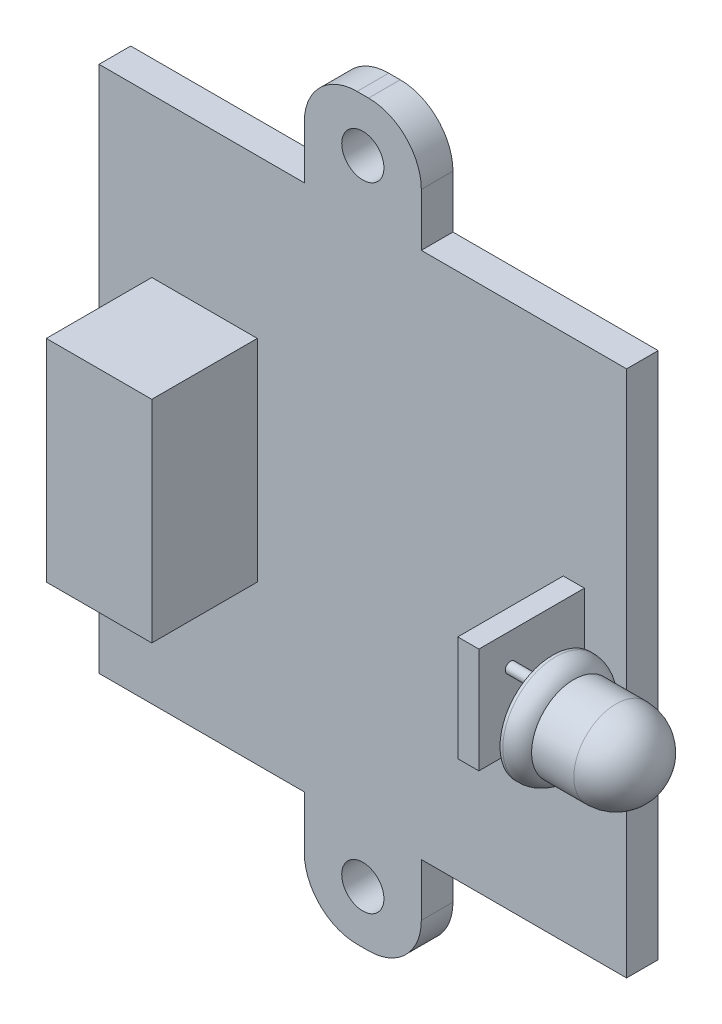
ISO-10303-21;
HEADER;
FILE_DESCRIPTION(('STEP AP214'),'2;1');
FILE_NAME('part.step','',(''),(''),'','','');
FILE_SCHEMA(('AUTOMOTIVE_DESIGN { 1 0 10303 214 1 1 1 1 }'));
ENDSEC;
DATA;
#1=APPLICATION_CONTEXT('core data for automotive mechanical design processes');
#2=APPLICATION_PROTOCOL_DEFINITION('international standard','automotive_design',2000,#1);
#3=PRODUCT_CONTEXT('',#1,'mechanical');
#4=PRODUCT('Part','Part','',(#3));
#5=PRODUCT_RELATED_PRODUCT_CATEGORY('part','',(#4));
#6=PRODUCT_DEFINITION_FORMATION('','',#4);
#7=PRODUCT_DEFINITION_CONTEXT('part definition',#1,'design');
#8=PRODUCT_DEFINITION('design','',#6,#7);
#9=PRODUCT_DEFINITION_SHAPE('','',#8);
#10=(LENGTH_UNIT() NAMED_UNIT(*) SI_UNIT(.MILLI.,.METRE.));
#11=(NAMED_UNIT(*) PLANE_ANGLE_UNIT() SI_UNIT($,.RADIAN.));
#12=(NAMED_UNIT(*) SI_UNIT($,.STERADIAN.) SOLID_ANGLE_UNIT());
#13=UNCERTAINTY_MEASURE_WITH_UNIT(LENGTH_MEASURE(1.E-05),#10,'distance_accuracy_value','');
#14=(GEOMETRIC_REPRESENTATION_CONTEXT(3) GLOBAL_UNCERTAINTY_ASSIGNED_CONTEXT((#13)) GLOBAL_UNIT_ASSIGNED_CONTEXT((#10,
#11,#12)) REPRESENTATION_CONTEXT('',''));
#15=CARTESIAN_POINT('',(0.,0.,0.));
#16=DIRECTION('',(0.,0.,1.));
#17=DIRECTION('',(1.,0.,0.));
#18=AXIS2_PLACEMENT_3D('',#15,#16,#17);
#19=CARTESIAN_POINT('',(28.,12.5,5.));
#20=DIRECTION('',(1.,0.,0.));
#21=DIRECTION('',(0.,0.,-1.));
#22=AXIS2_PLACEMENT_3D('',#19,#20,#21);
#23=SPHERICAL_SURFACE('',#22,2.);
#24=CARTESIAN_POINT('',(30.,12.5,5.));
#25=VERTEX_POINT('',#24);
#26=VERTEX_LOOP('',#25);
#27=FACE_BOUND('',#26,.T.);
#28=CARTESIAN_POINT('',(28.,12.5,5.));
#29=DIRECTION('',(-1.,0.,0.));
#30=DIRECTION('',(0.,0.,1.));
#31=AXIS2_PLACEMENT_3D('',#28,#29,#30);
#32=CIRCLE('',#31,2.);
#33=CARTESIAN_POINT('',(28.,12.5,7.));
#34=VERTEX_POINT('',#33);
#35=EDGE_CURVE('E494',#34,#34,#32,.T.);
#36=ORIENTED_EDGE('',*,*,#35,.F.);
#37=EDGE_LOOP('',(#36));
#38=FACE_BOUND('',#37,.T.);
#39=ADVANCED_FACE('F17',(#27,#38),#23,.T.);
#40=CARTESIAN_POINT('',(30.,12.5,5.));
#41=DIRECTION('',(-1.,0.,0.));
#42=DIRECTION('',(0.,0.,1.));
#43=AXIS2_PLACEMENT_3D('',#40,#41,#42);
#44=CYLINDRICAL_SURFACE('',#43,2.);
#45=ORIENTED_EDGE('',*,*,#35,.T.);
#46=EDGE_LOOP('',(#45));
#47=FACE_BOUND('',#46,.T.);
#48=CARTESIAN_POINT('',(26.,12.5,5.));
#49=DIRECTION('',(1.,0.,0.));
#50=DIRECTION('',(0.,0.,-1.));
#51=AXIS2_PLACEMENT_3D('',#48,#49,#50);
#52=CIRCLE('',#51,2.);
#53=CARTESIAN_POINT('',(26.,12.5,3.));
#54=VERTEX_POINT('',#53);
#55=EDGE_CURVE('E291',#54,#54,#52,.F.);
#56=ORIENTED_EDGE('',*,*,#55,.F.);
#57=EDGE_LOOP('',(#56));
#58=FACE_BOUND('',#57,.T.);
#59=ADVANCED_FACE('F300',(#47,#58),#44,.T.);
#60=CARTESIAN_POINT('',(25.1339745962156,12.5,5.));
#61=DIRECTION('',(1.,0.,0.));
#62=DIRECTION('',(0.,0.,-1.));
#63=AXIS2_PLACEMENT_3D('',#60,#61,#62);
#64=TOROIDAL_SURFACE('',#63,1.5,1.);
#65=CARTESIAN_POINT('',(25.1339745962156,12.5,5.));
#66=DIRECTION('',(-1.,0.,0.));
#67=DIRECTION('',(0.,0.,1.));
#68=AXIS2_PLACEMENT_3D('',#65,#66,#67);
#69=CIRCLE('',#68,2.5);
#70=CARTESIAN_POINT('',(25.1339745962156,12.5,7.5));
#71=VERTEX_POINT('',#70);
#72=EDGE_CURVE('E288',#71,#71,#69,.T.);
#73=ORIENTED_EDGE('',*,*,#72,.F.);
#74=EDGE_LOOP('',(#73));
#75=FACE_BOUND('',#74,.T.);
#76=ORIENTED_EDGE('',*,*,#55,.T.);
#77=EDGE_LOOP('',(#76));
#78=FACE_BOUND('',#77,.T.);
#79=ADVANCED_FACE('F296',(#75,#78),#64,.T.);
#80=CARTESIAN_POINT('',(26.,12.5,5.));
#81=DIRECTION('',(-1.,0.,0.));
#82=DIRECTION('',(0.,0.,1.));
#83=AXIS2_PLACEMENT_3D('',#80,#81,#82);
#84=CYLINDRICAL_SURFACE('',#83,2.5);
#85=ORIENTED_EDGE('',*,*,#72,.T.);
#86=EDGE_LOOP('',(#85));
#87=FACE_BOUND('',#86,.T.);
#88=CARTESIAN_POINT('',(25.,12.5,5.));
#89=DIRECTION('',(-1.,0.,0.));
#90=DIRECTION('',(0.,0.,1.));
#91=AXIS2_PLACEMENT_3D('',#88,#89,#90);
#92=CIRCLE('',#91,2.5);
#93=CARTESIAN_POINT('',(25.,12.5,7.5));
#94=VERTEX_POINT('',#93);
#95=EDGE_CURVE('E21',#94,#94,#92,.F.);
#96=ORIENTED_EDGE('',*,*,#95,.T.);
#97=EDGE_LOOP('',(#96));
#98=FACE_BOUND('',#97,.T.);
#99=ADVANCED_FACE('F299',(#87,#98),#84,.T.);
#100=CARTESIAN_POINT('',(25.,12.5,5.));
#101=DIRECTION('',(1.,0.,0.));
#102=DIRECTION('',(0.,0.,-1.));
#103=AXIS2_PLACEMENT_3D('',#100,#101,#102);
#104=PLANE('',#103);
#105=CARTESIAN_POINT('',(25.,11.5,5.));
#106=DIRECTION('',(-1.,0.,0.));
#107=DIRECTION('',(0.,0.,1.));
#108=AXIS2_PLACEMENT_3D('',#105,#106,#107);
#109=CIRCLE('',#108,0.25);
#110=CARTESIAN_POINT('',(25.,11.5,5.25));
#111=VERTEX_POINT('',#110);
#112=EDGE_CURVE('E287',#111,#111,#109,.T.);
#113=ORIENTED_EDGE('',*,*,#112,.F.);
#114=EDGE_LOOP('',(#113));
#115=FACE_BOUND('',#114,.T.);
#116=ORIENTED_EDGE('',*,*,#95,.F.);
#117=EDGE_LOOP('',(#116));
#118=FACE_BOUND('',#117,.T.);
#119=CARTESIAN_POINT('',(25.,13.5,5.));
#120=DIRECTION('',(-1.,0.,0.));
#121=DIRECTION('',(0.,0.,1.));
#122=AXIS2_PLACEMENT_3D('',#119,#120,#121);
#123=CIRCLE('',#122,0.25);
#124=CARTESIAN_POINT('',(25.,13.5,5.25));
#125=VERTEX_POINT('',#124);
#126=EDGE_CURVE('E274',#125,#125,#123,.T.);
#127=ORIENTED_EDGE('',*,*,#126,.F.);
#128=EDGE_LOOP('',(#127));
#129=FACE_BOUND('',#128,.T.);
#130=ADVANCED_FACE('F437',(#115,#118,#129),#104,.F.);
#131=CARTESIAN_POINT('',(0.,0.,6.5));
#132=DIRECTION('',(0.,0.,-1.));
#133=DIRECTION('',(-1.,0.,0.));
#134=AXIS2_PLACEMENT_3D('',#131,#132,#133);
#135=PLANE('',#134);
#136=DIRECTION('',(1.,0.,0.));
#137=VECTOR('',#136,1.);
#138=CARTESIAN_POINT('',(2.5,17.5,6.5));
#139=LINE('',#138,#137);
#140=CARTESIAN_POINT('',(7.5,17.5,6.5));
#141=VERTEX_POINT('',#140);
#142=CARTESIAN_POINT('',(2.5,17.5,6.5));
#143=VERTEX_POINT('',#142);
#144=EDGE_CURVE('E271',#141,#143,#139,.F.);
#145=ORIENTED_EDGE('',*,*,#144,.T.);
#146=DIRECTION('',(0.,1.,0.));
#147=VECTOR('',#146,1.);
#148=CARTESIAN_POINT('',(2.5,7.5,6.5));
#149=LINE('',#148,#147);
#150=CARTESIAN_POINT('',(2.5,7.5,6.5));
#151=VERTEX_POINT('',#150);
#152=EDGE_CURVE('E253',#143,#151,#149,.F.);
#153=ORIENTED_EDGE('',*,*,#152,.T.);
#154=DIRECTION('',(1.,0.,0.));
#155=VECTOR('',#154,1.);
#156=CARTESIAN_POINT('',(2.5,7.5,6.5));
#157=LINE('',#156,#155);
#158=CARTESIAN_POINT('',(7.5,7.5,6.5));
#159=VERTEX_POINT('',#158);
#160=EDGE_CURVE('E262',#151,#159,#157,.T.);
#161=ORIENTED_EDGE('',*,*,#160,.T.);
#162=DIRECTION('',(0.,1.,0.));
#163=VECTOR('',#162,1.);
#164=CARTESIAN_POINT('',(7.5,7.5,6.5));
#165=LINE('',#164,#163);
#166=EDGE_CURVE('E268',#159,#141,#165,.T.);
#167=ORIENTED_EDGE('',*,*,#166,.T.);
#168=EDGE_LOOP('',(#145,#153,#161,#167));
#169=FACE_BOUND('',#168,.T.);
#170=ADVANCED_FACE('F434',(#169),#135,.F.);
#171=CARTESIAN_POINT('',(25.,11.5,5.));
#172=DIRECTION('',(-1.,0.,0.));
#173=DIRECTION('',(0.,0.,1.));
#174=AXIS2_PLACEMENT_3D('',#171,#172,#173);
#175=CYLINDRICAL_SURFACE('',#174,0.25);
#176=ORIENTED_EDGE('',*,*,#112,.T.);
#177=EDGE_LOOP('',(#176));
#178=FACE_BOUND('',#177,.T.);
#179=CARTESIAN_POINT('',(23.,11.5,5.));
#180=DIRECTION('',(-1.,0.,0.));
#181=DIRECTION('',(0.,0.,1.));
#182=AXIS2_PLACEMENT_3D('',#179,#180,#181);
#183=CIRCLE('',#182,0.25);
#184=CARTESIAN_POINT('',(23.,11.5,5.25));
#185=VERTEX_POINT('',#184);
#186=EDGE_CURVE('E240',#185,#185,#183,.F.);
#187=ORIENTED_EDGE('',*,*,#186,.T.);
#188=EDGE_LOOP('',(#187));
#189=FACE_BOUND('',#188,.T.);
#190=ADVANCED_FACE('F430',(#178,#189),#175,.T.);
#191=CARTESIAN_POINT('',(22.,10.,6.5));
#192=DIRECTION('',(0.,1.,0.));
#193=DIRECTION('',(0.,0.,1.));
#194=AXIS2_PLACEMENT_3D('',#191,#192,#193);
#195=PLANE('',#194);
#196=DIRECTION('',(0.,0.,1.));
#197=VECTOR('',#196,1.);
#198=CARTESIAN_POINT('',(23.,10.,6.5));
#199=LINE('',#198,#197);
#200=CARTESIAN_POINT('',(23.,10.,1.5));
#201=VERTEX_POINT('',#200);
#202=CARTESIAN_POINT('',(23.,10.,6.5));
#203=VERTEX_POINT('',#202);
#204=EDGE_CURVE('E237',#201,#203,#199,.T.);
#205=ORIENTED_EDGE('',*,*,#204,.T.);
#206=DIRECTION('',(1.,0.,0.));
#207=VECTOR('',#206,1.);
#208=CARTESIAN_POINT('',(0.,10.,6.5));
#209=LINE('',#208,#207);
#210=CARTESIAN_POINT('',(22.,10.,6.5));
#211=VERTEX_POINT('',#210);
#212=EDGE_CURVE('E281',#211,#203,#209,.T.);
#213=ORIENTED_EDGE('',*,*,#212,.F.);
#214=DIRECTION('',(0.,0.,-1.));
#215=VECTOR('',#214,1.);
#216=CARTESIAN_POINT('',(22.,10.,6.5));
#217=LINE('',#216,#215);
#218=CARTESIAN_POINT('',(22.,10.,1.5));
#219=VERTEX_POINT('',#218);
#220=EDGE_CURVE('E241',#211,#219,#217,.T.);
#221=ORIENTED_EDGE('',*,*,#220,.T.);
#222=DIRECTION('',(1.,0.,0.));
#223=VECTOR('',#222,1.);
#224=CARTESIAN_POINT('',(22.,10.,1.5));
#225=LINE('',#224,#223);
#226=EDGE_CURVE('E284',#201,#219,#225,.F.);
#227=ORIENTED_EDGE('',*,*,#226,.F.);
#228=EDGE_LOOP('',(#205,#213,#221,#227));
#229=FACE_BOUND('',#228,.T.);
#230=ADVANCED_FACE('F426',(#229),#195,.F.);
#231=CARTESIAN_POINT('',(0.,0.,6.5));
#232=DIRECTION('',(0.,0.,1.));
#233=DIRECTION('',(1.,0.,0.));
#234=AXIS2_PLACEMENT_3D('',#231,#232,#233);
#235=PLANE('',#234);
#236=DIRECTION('',(0.,1.,0.));
#237=VECTOR('',#236,1.);
#238=CARTESIAN_POINT('',(22.,15.,6.5));
#239=LINE('',#238,#237);
#240=CARTESIAN_POINT('',(22.,15.,6.5));
#241=VERTEX_POINT('',#240);
#242=EDGE_CURVE('E244',#241,#211,#239,.F.);
#243=ORIENTED_EDGE('',*,*,#242,.T.);
#244=ORIENTED_EDGE('',*,*,#212,.T.);
#245=DIRECTION('',(0.,1.,0.));
#246=VECTOR('',#245,1.);
#247=CARTESIAN_POINT('',(23.,10.,6.5));
#248=LINE('',#247,#246);
#249=CARTESIAN_POINT('',(23.,15.,6.5));
#250=VERTEX_POINT('',#249);
#251=EDGE_CURVE('E234',#203,#250,#248,.T.);
#252=ORIENTED_EDGE('',*,*,#251,.T.);
#253=DIRECTION('',(1.,0.,0.));
#254=VECTOR('',#253,1.);
#255=CARTESIAN_POINT('',(23.,15.,6.5));
#256=LINE('',#255,#254);
#257=EDGE_CURVE('E278',#250,#241,#256,.F.);
#258=ORIENTED_EDGE('',*,*,#257,.T.);
#259=EDGE_LOOP('',(#243,#244,#252,#258));
#260=FACE_BOUND('',#259,.T.);
#261=ADVANCED_FACE('F422',(#260),#235,.T.);
#262=CARTESIAN_POINT('',(23.,15.,6.5));
#263=DIRECTION('',(0.,-1.,0.));
#264=DIRECTION('',(1.,0.,0.));
#265=AXIS2_PLACEMENT_3D('',#262,#263,#264);
#266=PLANE('',#265);
#267=DIRECTION('',(0.,0.,-1.));
#268=VECTOR('',#267,1.);
#269=CARTESIAN_POINT('',(22.,15.,6.5));
#270=LINE('',#269,#268);
#271=CARTESIAN_POINT('',(22.,15.,1.5));
#272=VERTEX_POINT('',#271);
#273=EDGE_CURVE('E247',#272,#241,#270,.F.);
#274=ORIENTED_EDGE('',*,*,#273,.T.);
#275=ORIENTED_EDGE('',*,*,#257,.F.);
#276=DIRECTION('',(0.,0.,1.));
#277=VECTOR('',#276,1.);
#278=CARTESIAN_POINT('',(23.,15.,6.5));
#279=LINE('',#278,#277);
#280=CARTESIAN_POINT('',(23.,15.,1.5));
#281=VERTEX_POINT('',#280);
#282=EDGE_CURVE('E231',#250,#281,#279,.F.);
#283=ORIENTED_EDGE('',*,*,#282,.T.);
#284=DIRECTION('',(1.,0.,0.));
#285=VECTOR('',#284,1.);
#286=CARTESIAN_POINT('',(23.,15.,1.5));
#287=LINE('',#286,#285);
#288=EDGE_CURVE('E275',#272,#281,#287,.T.);
#289=ORIENTED_EDGE('',*,*,#288,.F.);
#290=EDGE_LOOP('',(#274,#275,#283,#289));
#291=FACE_BOUND('',#290,.T.);
#292=ADVANCED_FACE('F418',(#291),#266,.F.);
#293=CARTESIAN_POINT('',(25.,13.5,5.));
#294=DIRECTION('',(-1.,0.,0.));
#295=DIRECTION('',(0.,0.,1.));
#296=AXIS2_PLACEMENT_3D('',#293,#294,#295);
#297=CYLINDRICAL_SURFACE('',#296,0.25);
#298=ORIENTED_EDGE('',*,*,#126,.T.);
#299=EDGE_LOOP('',(#298));
#300=FACE_BOUND('',#299,.T.);
#301=CARTESIAN_POINT('',(23.,13.5,5.));
#302=DIRECTION('',(-1.,0.,0.));
#303=DIRECTION('',(0.,0.,1.));
#304=AXIS2_PLACEMENT_3D('',#301,#302,#303);
#305=CIRCLE('',#304,0.25);
#306=CARTESIAN_POINT('',(23.,13.5,5.25));
#307=VERTEX_POINT('',#306);
#308=EDGE_CURVE('E220',#307,#307,#305,.F.);
#309=ORIENTED_EDGE('',*,*,#308,.T.);
#310=EDGE_LOOP('',(#309));
#311=FACE_BOUND('',#310,.T.);
#312=ADVANCED_FACE('F414',(#300,#311),#297,.T.);
#313=CARTESIAN_POINT('',(2.5,17.5,6.5));
#314=DIRECTION('',(0.,-1.,0.));
#315=DIRECTION('',(0.,0.,-1.));
#316=AXIS2_PLACEMENT_3D('',#313,#314,#315);
#317=PLANE('',#316);
#318=DIRECTION('',(0.,0.,-1.));
#319=VECTOR('',#318,1.);
#320=CARTESIAN_POINT('',(2.5,17.5,6.5));
#321=LINE('',#320,#319);
#322=CARTESIAN_POINT('',(2.5,17.5,1.5));
#323=VERTEX_POINT('',#322);
#324=EDGE_CURVE('E256',#323,#143,#321,.F.);
#325=ORIENTED_EDGE('',*,*,#324,.T.);
#326=ORIENTED_EDGE('',*,*,#144,.F.);
#327=DIRECTION('',(0.,0.,1.));
#328=VECTOR('',#327,1.);
#329=CARTESIAN_POINT('',(7.5,17.5,6.5));
#330=LINE('',#329,#328);
#331=CARTESIAN_POINT('',(7.5,17.5,1.5));
#332=VERTEX_POINT('',#331);
#333=EDGE_CURVE('E265',#141,#332,#330,.F.);
#334=ORIENTED_EDGE('',*,*,#333,.T.);
#335=DIRECTION('',(1.,0.,0.));
#336=VECTOR('',#335,1.);
#337=CARTESIAN_POINT('',(0.,17.5,1.5));
#338=LINE('',#337,#336);
#339=EDGE_CURVE('E174',#323,#332,#338,.T.);
#340=ORIENTED_EDGE('',*,*,#339,.F.);
#341=EDGE_LOOP('',(#325,#326,#334,#340));
#342=FACE_BOUND('',#341,.T.);
#343=ADVANCED_FACE('F410',(#342),#317,.F.);
#344=CARTESIAN_POINT('',(7.5,7.5,6.5));
#345=DIRECTION('',(-1.,0.,0.));
#346=DIRECTION('',(0.,0.,1.));
#347=AXIS2_PLACEMENT_3D('',#344,#345,#346);
#348=PLANE('',#347);
#349=ORIENTED_EDGE('',*,*,#333,.F.);
#350=ORIENTED_EDGE('',*,*,#166,.F.);
#351=DIRECTION('',(0.,0.,1.));
#352=VECTOR('',#351,1.);
#353=CARTESIAN_POINT('',(7.5,7.5,6.5));
#354=LINE('',#353,#352);
#355=CARTESIAN_POINT('',(7.5,7.5,1.5));
#356=VERTEX_POINT('',#355);
#357=EDGE_CURVE('E259',#159,#356,#354,.F.);
#358=ORIENTED_EDGE('',*,*,#357,.T.);
#359=DIRECTION('',(0.,1.,0.));
#360=VECTOR('',#359,1.);
#361=CARTESIAN_POINT('',(7.5,0.,1.5));
#362=LINE('',#361,#360);
#363=EDGE_CURVE('E171',#332,#356,#362,.F.);
#364=ORIENTED_EDGE('',*,*,#363,.F.);
#365=EDGE_LOOP('',(#349,#350,#358,#364));
#366=FACE_BOUND('',#365,.T.);
#367=ADVANCED_FACE('F406',(#366),#348,.F.);
#368=CARTESIAN_POINT('',(2.5,7.5,6.5));
#369=DIRECTION('',(0.,1.,0.));
#370=DIRECTION('',(0.,0.,1.));
#371=AXIS2_PLACEMENT_3D('',#368,#369,#370);
#372=PLANE('',#371);
#373=ORIENTED_EDGE('',*,*,#357,.F.);
#374=ORIENTED_EDGE('',*,*,#160,.F.);
#375=DIRECTION('',(0.,0.,-1.));
#376=VECTOR('',#375,1.);
#377=CARTESIAN_POINT('',(2.5,7.5,6.5));
#378=LINE('',#377,#376);
#379=CARTESIAN_POINT('',(2.5,7.5,1.5));
#380=VERTEX_POINT('',#379);
#381=EDGE_CURVE('E250',#151,#380,#378,.T.);
#382=ORIENTED_EDGE('',*,*,#381,.T.);
#383=DIRECTION('',(1.,0.,0.));
#384=VECTOR('',#383,1.);
#385=CARTESIAN_POINT('',(0.,7.5,1.5));
#386=LINE('',#385,#384);
#387=EDGE_CURVE('E168',#356,#380,#386,.F.);
#388=ORIENTED_EDGE('',*,*,#387,.F.);
#389=EDGE_LOOP('',(#373,#374,#382,#388));
#390=FACE_BOUND('',#389,.T.);
#391=ADVANCED_FACE('F402',(#390),#372,.F.);
#392=CARTESIAN_POINT('',(2.5,7.5,6.5));
#393=DIRECTION('',(1.,0.,0.));
#394=DIRECTION('',(0.,0.,-1.));
#395=AXIS2_PLACEMENT_3D('',#392,#393,#394);
#396=PLANE('',#395);
#397=ORIENTED_EDGE('',*,*,#381,.F.);
#398=ORIENTED_EDGE('',*,*,#152,.F.);
#399=ORIENTED_EDGE('',*,*,#324,.F.);
#400=DIRECTION('',(0.,1.,0.));
#401=VECTOR('',#400,1.);
#402=CARTESIAN_POINT('',(2.5,0.,1.5));
#403=LINE('',#402,#401);
#404=EDGE_CURVE('E165',#380,#323,#403,.T.);
#405=ORIENTED_EDGE('',*,*,#404,.F.);
#406=EDGE_LOOP('',(#397,#398,#399,#405));
#407=FACE_BOUND('',#406,.T.);
#408=ADVANCED_FACE('F398',(#407),#396,.F.);
#409=CARTESIAN_POINT('',(22.,15.,6.5));
#410=DIRECTION('',(1.,0.,0.));
#411=DIRECTION('',(0.,0.,-1.));
#412=AXIS2_PLACEMENT_3D('',#409,#410,#411);
#413=PLANE('',#412);
#414=ORIENTED_EDGE('',*,*,#220,.F.);
#415=ORIENTED_EDGE('',*,*,#242,.F.);
#416=ORIENTED_EDGE('',*,*,#273,.F.);
#417=DIRECTION('',(0.,1.,0.));
#418=VECTOR('',#417,1.);
#419=CARTESIAN_POINT('',(22.,0.,1.5));
#420=LINE('',#419,#418);
#421=EDGE_CURVE('E158',#219,#272,#420,.T.);
#422=ORIENTED_EDGE('',*,*,#421,.F.);
#423=EDGE_LOOP('',(#414,#415,#416,#422));
#424=FACE_BOUND('',#423,.T.);
#425=ADVANCED_FACE('F394',(#424),#413,.F.);
#426=CARTESIAN_POINT('',(23.,10.,6.5));
#427=DIRECTION('',(-1.,0.,0.));
#428=DIRECTION('',(0.,0.,1.));
#429=AXIS2_PLACEMENT_3D('',#426,#427,#428);
#430=PLANE('',#429);
#431=ORIENTED_EDGE('',*,*,#308,.F.);
#432=EDGE_LOOP('',(#431));
#433=FACE_BOUND('',#432,.T.);
#434=ORIENTED_EDGE('',*,*,#282,.F.);
#435=ORIENTED_EDGE('',*,*,#251,.F.);
#436=ORIENTED_EDGE('',*,*,#204,.F.);
#437=DIRECTION('',(0.,1.,0.));
#438=VECTOR('',#437,1.);
#439=CARTESIAN_POINT('',(23.,0.,1.5));
#440=LINE('',#439,#438);
#441=EDGE_CURVE('E154',#281,#201,#440,.F.);
#442=ORIENTED_EDGE('',*,*,#441,.F.);
#443=EDGE_LOOP('',(#434,#435,#436,#442));
#444=FACE_BOUND('',#443,.T.);
#445=ORIENTED_EDGE('',*,*,#186,.F.);
#446=EDGE_LOOP('',(#445));
#447=FACE_BOUND('',#446,.T.);
#448=ADVANCED_FACE('F390',(#433,#444,#447),#430,.F.);
#449=CARTESIAN_POINT('',(0.,-5.,1.5));
#450=DIRECTION('',(0.,1.,0.));
#451=DIRECTION('',(0.,0.,1.));
#452=AXIS2_PLACEMENT_3D('',#449,#450,#451);
#453=PLANE('',#452);
#454=DIRECTION('',(0.,0.,-1.));
#455=VECTOR('',#454,1.);
#456=CARTESIAN_POINT('',(12.7722949685963,-5.,1.5));
#457=LINE('',#456,#455);
#458=CARTESIAN_POINT('',(12.7722949685963,-5.,1.5));
#459=VERTEX_POINT('',#458);
#460=CARTESIAN_POINT('',(12.7722949685963,-5.,0.));
#461=VERTEX_POINT('',#460);
#462=EDGE_CURVE('E126',#459,#461,#457,.T.);
#463=ORIENTED_EDGE('',*,*,#462,.F.);
#464=DIRECTION('',(1.,0.,0.));
#465=VECTOR('',#464,1.);
#466=CARTESIAN_POINT('',(0.,-5.,1.5));
#467=LINE('',#466,#465);
#468=CARTESIAN_POINT('',(12.2277050314038,-5.,1.5));
#469=VERTEX_POINT('',#468);
#470=EDGE_CURVE('E161',#469,#459,#467,.T.);
#471=ORIENTED_EDGE('',*,*,#470,.F.);
#472=DIRECTION('',(0.,0.,1.));
#473=VECTOR('',#472,1.);
#474=CARTESIAN_POINT('',(12.2277050314038,-5.,1.5));
#475=LINE('',#474,#473);
#476=CARTESIAN_POINT('',(12.2277050314038,-5.,0.));
#477=VERTEX_POINT('',#476);
#478=EDGE_CURVE('E101',#477,#469,#475,.T.);
#479=ORIENTED_EDGE('',*,*,#478,.F.);
#480=DIRECTION('',(1.,0.,0.));
#481=VECTOR('',#480,1.);
#482=CARTESIAN_POINT('',(0.,-5.,0.));
#483=LINE('',#482,#481);
#484=EDGE_CURVE('E189',#461,#477,#483,.F.);
#485=ORIENTED_EDGE('',*,*,#484,.F.);
#486=EDGE_LOOP('',(#463,#471,#479,#485));
#487=FACE_BOUND('',#486,.T.);
#488=ADVANCED_FACE('F386',(#487),#453,.F.);
#489=CARTESIAN_POINT('',(0.,30.,1.5));
#490=DIRECTION('',(0.,1.,0.));
#491=DIRECTION('',(0.,0.,1.));
#492=AXIS2_PLACEMENT_3D('',#489,#490,#491);
#493=PLANE('',#492);
#494=DIRECTION('',(1.,0.,0.));
#495=VECTOR('',#494,1.);
#496=CARTESIAN_POINT('',(0.,30.,1.5));
#497=LINE('',#496,#495);
#498=CARTESIAN_POINT('',(12.7722949685963,30.,1.5));
#499=VERTEX_POINT('',#498);
#500=CARTESIAN_POINT('',(12.2277050314038,30.,1.5));
#501=VERTEX_POINT('',#500);
#502=EDGE_CURVE('E163',#499,#501,#497,.F.);
#503=ORIENTED_EDGE('',*,*,#502,.F.);
#504=DIRECTION('',(0.,0.,-1.));
#505=VECTOR('',#504,1.);
#506=CARTESIAN_POINT('',(12.7722949685963,30.,1.5));
#507=LINE('',#506,#505);
#508=CARTESIAN_POINT('',(12.7722949685963,30.,0.));
#509=VERTEX_POINT('',#508);
#510=EDGE_CURVE('E472',#509,#499,#507,.F.);
#511=ORIENTED_EDGE('',*,*,#510,.F.);
#512=DIRECTION('',(1.,0.,0.));
#513=VECTOR('',#512,1.);
#514=CARTESIAN_POINT('',(0.,30.,0.));
#515=LINE('',#514,#513);
#516=CARTESIAN_POINT('',(12.2277050314038,30.,0.));
#517=VERTEX_POINT('',#516);
#518=EDGE_CURVE('E177',#509,#517,#515,.F.);
#519=ORIENTED_EDGE('',*,*,#518,.T.);
#520=DIRECTION('',(0.,0.,1.));
#521=VECTOR('',#520,1.);
#522=CARTESIAN_POINT('',(12.2277050314038,30.,1.5));
#523=LINE('',#522,#521);
#524=EDGE_CURVE('E471',#501,#517,#523,.F.);
#525=ORIENTED_EDGE('',*,*,#524,.F.);
#526=EDGE_LOOP('',(#503,#511,#519,#525));
#527=FACE_BOUND('',#526,.T.);
#528=ADVANCED_FACE('F382',(#527),#493,.T.);
#529=CARTESIAN_POINT('',(0.,0.,1.5));
#530=DIRECTION('',(0.,0.,1.));
#531=DIRECTION('',(1.,0.,0.));
#532=AXIS2_PLACEMENT_3D('',#529,#530,#531);
#533=PLANE('',#532);
#534=ORIENTED_EDGE('',*,*,#441,.T.);
#535=ORIENTED_EDGE('',*,*,#226,.T.);
#536=ORIENTED_EDGE('',*,*,#421,.T.);
#537=ORIENTED_EDGE('',*,*,#288,.T.);
#538=EDGE_LOOP('',(#534,#535,#536,#537));
#539=FACE_BOUND('',#538,.T.);
#540=CARTESIAN_POINT('',(12.5,-2.5,1.5));
#541=DIRECTION('',(0.,0.,-1.));
#542=DIRECTION('',(-1.,0.,0.));
#543=AXIS2_PLACEMENT_3D('',#540,#541,#542);
#544=CIRCLE('',#543,1.);
#545=CARTESIAN_POINT('',(11.5,-2.5,1.5));
#546=VERTEX_POINT('',#545);
#547=EDGE_CURVE('E475',#546,#546,#544,.T.);
#548=ORIENTED_EDGE('',*,*,#547,.T.);
#549=EDGE_LOOP('',(#548));
#550=FACE_BOUND('',#549,.T.);
#551=CARTESIAN_POINT('',(12.5,27.5,1.5));
#552=DIRECTION('',(0.,0.,-1.));
#553=DIRECTION('',(-1.,0.,0.));
#554=AXIS2_PLACEMENT_3D('',#551,#552,#553);
#555=CIRCLE('',#554,1.);
#556=CARTESIAN_POINT('',(11.5,27.5,1.5));
#557=VERTEX_POINT('',#556);
#558=EDGE_CURVE('E181',#557,#557,#555,.T.);
#559=ORIENTED_EDGE('',*,*,#558,.T.);
#560=EDGE_LOOP('',(#559));
#561=FACE_BOUND('',#560,.T.);
#562=DIRECTION('',(0.,1.,0.));
#563=VECTOR('',#562,1.);
#564=CARTESIAN_POINT('',(15.2722949685963,0.,1.5));
#565=LINE('',#564,#563);
#566=CARTESIAN_POINT('',(15.2722949685963,27.5,1.5));
#567=VERTEX_POINT('',#566);
#568=CARTESIAN_POINT('',(15.2722949685963,25.,1.5));
#569=VERTEX_POINT('',#568);
#570=EDGE_CURVE('E190',#567,#569,#565,.F.);
#571=ORIENTED_EDGE('',*,*,#570,.F.);
#572=CARTESIAN_POINT('',(12.7722949685963,27.5,1.5));
#573=DIRECTION('',(0.,0.,-1.));
#574=DIRECTION('',(-1.,0.,0.));
#575=AXIS2_PLACEMENT_3D('',#572,#573,#574);
#576=CIRCLE('',#575,2.5);
#577=EDGE_CURVE('E465',#499,#567,#576,.T.);
#578=ORIENTED_EDGE('',*,*,#577,.F.);
#579=ORIENTED_EDGE('',*,*,#502,.T.);
#580=CARTESIAN_POINT('',(12.2277050314038,27.5,1.5));
#581=DIRECTION('',(0.,0.,1.));
#582=DIRECTION('',(1.,0.,0.));
#583=AXIS2_PLACEMENT_3D('',#580,#581,#582);
#584=CIRCLE('',#583,2.5);
#585=CARTESIAN_POINT('',(9.72770503140375,27.5,1.5));
#586=VERTEX_POINT('',#585);
#587=EDGE_CURVE('E468',#586,#501,#584,.F.);
#588=ORIENTED_EDGE('',*,*,#587,.F.);
#589=DIRECTION('',(0.,1.,0.));
#590=VECTOR('',#589,1.);
#591=CARTESIAN_POINT('',(9.72770503140375,0.,1.5));
#592=LINE('',#591,#590);
#593=CARTESIAN_POINT('',(9.72770503140375,25.,1.5));
#594=VERTEX_POINT('',#593);
#595=EDGE_CURVE('E178',#586,#594,#592,.F.);
#596=ORIENTED_EDGE('',*,*,#595,.T.);
#597=DIRECTION('',(1.,0.,0.));
#598=VECTOR('',#597,1.);
#599=CARTESIAN_POINT('',(0.,25.,1.5));
#600=LINE('',#599,#598);
#601=CARTESIAN_POINT('',(0.,25.,1.5));
#602=VERTEX_POINT('',#601);
#603=EDGE_CURVE('E157',#602,#594,#600,.T.);
#604=ORIENTED_EDGE('',*,*,#603,.F.);
#605=DIRECTION('',(0.,1.,0.));
#606=VECTOR('',#605,1.);
#607=CARTESIAN_POINT('',(0.,0.,1.5));
#608=LINE('',#607,#606);
#609=CARTESIAN_POINT('',(0.,0.,1.5));
#610=VERTEX_POINT('',#609);
#611=EDGE_CURVE('E151',#610,#602,#608,.T.);
#612=ORIENTED_EDGE('',*,*,#611,.F.);
#613=DIRECTION('',(1.,0.,0.));
#614=VECTOR('',#613,1.);
#615=CARTESIAN_POINT('',(0.,0.,1.5));
#616=LINE('',#615,#614);
#617=CARTESIAN_POINT('',(9.72770503140375,0.,1.5));
#618=VERTEX_POINT('',#617);
#619=EDGE_CURVE('E113',#610,#618,#616,.T.);
#620=ORIENTED_EDGE('',*,*,#619,.T.);
#621=DIRECTION('',(0.,1.,0.));
#622=VECTOR('',#621,1.);
#623=CARTESIAN_POINT('',(9.72770503140375,0.,1.5));
#624=LINE('',#623,#622);
#625=CARTESIAN_POINT('',(9.72770503140375,-2.5,1.5));
#626=VERTEX_POINT('',#625);
#627=EDGE_CURVE('E107',#626,#618,#624,.T.);
#628=ORIENTED_EDGE('',*,*,#627,.F.);
#629=CARTESIAN_POINT('',(12.2277050314038,-2.5,1.5));
#630=DIRECTION('',(0.,0.,1.));
#631=DIRECTION('',(1.,0.,0.));
#632=AXIS2_PLACEMENT_3D('',#629,#630,#631);
#633=CIRCLE('',#632,2.5);
#634=EDGE_CURVE('E93',#469,#626,#633,.F.);
#635=ORIENTED_EDGE('',*,*,#634,.F.);
#636=ORIENTED_EDGE('',*,*,#470,.T.);
#637=CARTESIAN_POINT('',(12.7722949685963,-2.5,1.5));
#638=DIRECTION('',(0.,0.,-1.));
#639=DIRECTION('',(-1.,0.,0.));
#640=AXIS2_PLACEMENT_3D('',#637,#638,#639);
#641=CIRCLE('',#640,2.5);
#642=CARTESIAN_POINT('',(15.2722949685963,-2.5,1.5));
#643=VERTEX_POINT('',#642);
#644=EDGE_CURVE('E123',#643,#459,#641,.T.);
#645=ORIENTED_EDGE('',*,*,#644,.F.);
#646=DIRECTION('',(0.,1.,0.));
#647=VECTOR('',#646,1.);
#648=CARTESIAN_POINT('',(15.2722949685963,0.,1.5));
#649=LINE('',#648,#647);
#650=CARTESIAN_POINT('',(15.2722949685963,0.,1.5));
#651=VERTEX_POINT('',#650);
#652=EDGE_CURVE('E214',#643,#651,#649,.T.);
#653=ORIENTED_EDGE('',*,*,#652,.T.);
#654=DIRECTION('',(1.,0.,0.));
#655=VECTOR('',#654,1.);
#656=CARTESIAN_POINT('',(0.,0.,1.5));
#657=LINE('',#656,#655);
#658=CARTESIAN_POINT('',(25.,0.,1.5));
#659=VERTEX_POINT('',#658);
#660=EDGE_CURVE('E208',#651,#659,#657,.T.);
#661=ORIENTED_EDGE('',*,*,#660,.T.);
#662=DIRECTION('',(0.,1.,0.));
#663=VECTOR('',#662,1.);
#664=CARTESIAN_POINT('',(25.,0.,1.5));
#665=LINE('',#664,#663);
#666=CARTESIAN_POINT('',(25.,25.,1.5));
#667=VERTEX_POINT('',#666);
#668=EDGE_CURVE('E200',#659,#667,#665,.T.);
#669=ORIENTED_EDGE('',*,*,#668,.T.);
#670=DIRECTION('',(1.,0.,0.));
#671=VECTOR('',#670,1.);
#672=CARTESIAN_POINT('',(0.,25.,1.5));
#673=LINE('',#672,#671);
#674=EDGE_CURVE('E197',#569,#667,#673,.T.);
#675=ORIENTED_EDGE('',*,*,#674,.F.);
#676=EDGE_LOOP('',(#571,#578,#579,#588,#596,#604,#612,#620,#628,#635,#636,#645,#653,#661,#669,#675));
#677=FACE_BOUND('',#676,.T.);
#678=ORIENTED_EDGE('',*,*,#387,.T.);
#679=ORIENTED_EDGE('',*,*,#404,.T.);
#680=ORIENTED_EDGE('',*,*,#339,.T.);
#681=ORIENTED_EDGE('',*,*,#363,.T.);
#682=EDGE_LOOP('',(#678,#679,#680,#681));
#683=FACE_BOUND('',#682,.T.);
#684=ADVANCED_FACE('F109',(#539,#550,#561,#677,#683),#533,.T.);
#685=CARTESIAN_POINT('',(0.,25.,1.5));
#686=DIRECTION('',(0.,1.,0.));
#687=DIRECTION('',(0.,0.,1.));
#688=AXIS2_PLACEMENT_3D('',#685,#686,#687);
#689=PLANE('',#688);
#690=ORIENTED_EDGE('',*,*,#603,.T.);
#691=DIRECTION('',(0.,0.,-1.));
#692=VECTOR('',#691,1.);
#693=CARTESIAN_POINT('',(9.72770503140375,25.,1.5));
#694=LINE('',#693,#692);
#695=CARTESIAN_POINT('',(9.72770503140375,25.,0.));
#696=VERTEX_POINT('',#695);
#697=EDGE_CURVE('E520',#594,#696,#694,.T.);
#698=ORIENTED_EDGE('',*,*,#697,.T.);
#699=DIRECTION('',(1.,0.,0.));
#700=VECTOR('',#699,1.);
#701=CARTESIAN_POINT('',(0.,25.,0.));
#702=LINE('',#701,#700);
#703=CARTESIAN_POINT('',(0.,25.,0.));
#704=VERTEX_POINT('',#703);
#705=EDGE_CURVE('E146',#696,#704,#702,.F.);
#706=ORIENTED_EDGE('',*,*,#705,.T.);
#707=DIRECTION('',(0.,0.,1.));
#708=VECTOR('',#707,1.);
#709=CARTESIAN_POINT('',(0.,25.,1.5));
#710=LINE('',#709,#708);
#711=EDGE_CURVE('E141',#602,#704,#710,.F.);
#712=ORIENTED_EDGE('',*,*,#711,.F.);
#713=EDGE_LOOP('',(#690,#698,#706,#712));
#714=FACE_BOUND('',#713,.T.);
#715=ADVANCED_FACE('F375',(#714),#689,.T.);
#716=CARTESIAN_POINT('',(0.,0.,1.5));
#717=DIRECTION('',(-1.,0.,0.));
#718=DIRECTION('',(0.,0.,1.));
#719=AXIS2_PLACEMENT_3D('',#716,#717,#718);
#720=PLANE('',#719);
#721=ORIENTED_EDGE('',*,*,#611,.T.);
#722=ORIENTED_EDGE('',*,*,#711,.T.);
#723=DIRECTION('',(0.,1.,0.));
#724=VECTOR('',#723,1.);
#725=CARTESIAN_POINT('',(0.,0.,0.));
#726=LINE('',#725,#724);
#727=CARTESIAN_POINT('',(0.,0.,0.));
#728=VERTEX_POINT('',#727);
#729=EDGE_CURVE('E135',#704,#728,#726,.F.);
#730=ORIENTED_EDGE('',*,*,#729,.T.);
#731=DIRECTION('',(0.,0.,1.));
#732=VECTOR('',#731,1.);
#733=CARTESIAN_POINT('',(0.,0.,1.5));
#734=LINE('',#733,#732);
#735=EDGE_CURVE('E138',#728,#610,#734,.T.);
#736=ORIENTED_EDGE('',*,*,#735,.T.);
#737=EDGE_LOOP('',(#721,#722,#730,#736));
#738=FACE_BOUND('',#737,.T.);
#739=ADVANCED_FACE('F371',(#738),#720,.T.);
#740=CARTESIAN_POINT('',(0.,0.,1.5));
#741=DIRECTION('',(0.,1.,0.));
#742=DIRECTION('',(0.,0.,1.));
#743=AXIS2_PLACEMENT_3D('',#740,#741,#742);
#744=PLANE('',#743);
#745=DIRECTION('',(0.,0.,1.));
#746=VECTOR('',#745,1.);
#747=CARTESIAN_POINT('',(9.72770503140375,0.,1.5));
#748=LINE('',#747,#746);
#749=CARTESIAN_POINT('',(9.72770503140375,0.,0.));
#750=VERTEX_POINT('',#749);
#751=EDGE_CURVE('E103',#618,#750,#748,.F.);
#752=ORIENTED_EDGE('',*,*,#751,.F.);
#753=ORIENTED_EDGE('',*,*,#619,.F.);
#754=ORIENTED_EDGE('',*,*,#735,.F.);
#755=DIRECTION('',(1.,0.,0.));
#756=VECTOR('',#755,1.);
#757=CARTESIAN_POINT('',(0.,0.,0.));
#758=LINE('',#757,#756);
#759=EDGE_CURVE('E132',#728,#750,#758,.T.);
#760=ORIENTED_EDGE('',*,*,#759,.T.);
#761=EDGE_LOOP('',(#752,#753,#754,#760));
#762=FACE_BOUND('',#761,.T.);
#763=ADVANCED_FACE('F368',(#762),#744,.F.);
#764=CARTESIAN_POINT('',(9.72770503140375,0.,1.5));
#765=DIRECTION('',(-1.,0.,0.));
#766=DIRECTION('',(0.,0.,1.));
#767=AXIS2_PLACEMENT_3D('',#764,#765,#766);
#768=PLANE('',#767);
#769=ORIENTED_EDGE('',*,*,#627,.T.);
#770=ORIENTED_EDGE('',*,*,#751,.T.);
#771=DIRECTION('',(0.,1.,0.));
#772=VECTOR('',#771,1.);
#773=CARTESIAN_POINT('',(9.72770503140375,0.,0.));
#774=LINE('',#773,#772);
#775=CARTESIAN_POINT('',(9.72770503140375,-2.5,0.));
#776=VERTEX_POINT('',#775);
#777=EDGE_CURVE('E121',#750,#776,#774,.F.);
#778=ORIENTED_EDGE('',*,*,#777,.T.);
#779=DIRECTION('',(0.,0.,1.));
#780=VECTOR('',#779,1.);
#781=CARTESIAN_POINT('',(9.72770503140375,-2.5,1.5));
#782=LINE('',#781,#780);
#783=EDGE_CURVE('E98',#626,#776,#782,.F.);
#784=ORIENTED_EDGE('',*,*,#783,.F.);
#785=EDGE_LOOP('',(#769,#770,#778,#784));
#786=FACE_BOUND('',#785,.T.);
#787=ADVANCED_FACE('F119',(#786),#768,.T.);
#788=CARTESIAN_POINT('',(12.2277050314038,-2.5,1.5));
#789=DIRECTION('',(0.,0.,1.));
#790=DIRECTION('',(1.,0.,0.));
#791=AXIS2_PLACEMENT_3D('',#788,#789,#790);
#792=CYLINDRICAL_SURFACE('',#791,2.5);
#793=CARTESIAN_POINT('',(12.2277050314038,-2.5,0.));
#794=DIRECTION('',(0.,0.,1.));
#795=DIRECTION('',(1.,0.,0.));
#796=AXIS2_PLACEMENT_3D('',#793,#794,#795);
#797=CIRCLE('',#796,2.5);
#798=EDGE_CURVE('E478',#776,#477,#797,.T.);
#799=ORIENTED_EDGE('',*,*,#798,.T.);
#800=ORIENTED_EDGE('',*,*,#478,.T.);
#801=ORIENTED_EDGE('',*,*,#634,.T.);
#802=ORIENTED_EDGE('',*,*,#783,.T.);
#803=EDGE_LOOP('',(#799,#800,#801,#802));
#804=FACE_BOUND('',#803,.T.);
#805=ADVANCED_FACE('F96',(#804),#792,.T.);
#806=CARTESIAN_POINT('',(12.7722949685963,-2.5,1.5));
#807=DIRECTION('',(0.,0.,-1.));
#808=DIRECTION('',(-1.,0.,0.));
#809=AXIS2_PLACEMENT_3D('',#806,#807,#808);
#810=CYLINDRICAL_SURFACE('',#809,2.5);
#811=CARTESIAN_POINT('',(12.7722949685963,-2.5,0.));
#812=DIRECTION('',(0.,0.,-1.));
#813=DIRECTION('',(-1.,0.,0.));
#814=AXIS2_PLACEMENT_3D('',#811,#812,#813);
#815=CIRCLE('',#814,2.5);
#816=CARTESIAN_POINT('',(15.2722949685963,-2.5,0.));
#817=VERTEX_POINT('',#816);
#818=EDGE_CURVE('E480',#461,#817,#815,.F.);
#819=ORIENTED_EDGE('',*,*,#818,.T.);
#820=DIRECTION('',(0.,0.,1.));
#821=VECTOR('',#820,1.);
#822=CARTESIAN_POINT('',(15.2722949685963,-2.5,1.5));
#823=LINE('',#822,#821);
#824=EDGE_CURVE('E217',#817,#643,#823,.T.);
#825=ORIENTED_EDGE('',*,*,#824,.T.);
#826=ORIENTED_EDGE('',*,*,#644,.T.);
#827=ORIENTED_EDGE('',*,*,#462,.T.);
#828=EDGE_LOOP('',(#819,#825,#826,#827));
#829=FACE_BOUND('',#828,.T.);
#830=ADVANCED_FACE('F359',(#829),#810,.T.);
#831=CARTESIAN_POINT('',(15.2722949685963,0.,1.5));
#832=DIRECTION('',(-1.,0.,0.));
#833=DIRECTION('',(0.,0.,1.));
#834=AXIS2_PLACEMENT_3D('',#831,#832,#833);
#835=PLANE('',#834);
#836=ORIENTED_EDGE('',*,*,#824,.F.);
#837=DIRECTION('',(0.,1.,0.));
#838=VECTOR('',#837,1.);
#839=CARTESIAN_POINT('',(15.2722949685963,0.,0.));
#840=LINE('',#839,#838);
#841=CARTESIAN_POINT('',(15.2722949685963,0.,0.));
#842=VERTEX_POINT('',#841);
#843=EDGE_CURVE('E483',#817,#842,#840,.T.);
#844=ORIENTED_EDGE('',*,*,#843,.T.);
#845=DIRECTION('',(0.,0.,1.));
#846=VECTOR('',#845,1.);
#847=CARTESIAN_POINT('',(15.2722949685963,0.,1.5));
#848=LINE('',#847,#846);
#849=EDGE_CURVE('E211',#842,#651,#848,.T.);
#850=ORIENTED_EDGE('',*,*,#849,.T.);
#851=ORIENTED_EDGE('',*,*,#652,.F.);
#852=EDGE_LOOP('',(#836,#844,#850,#851));
#853=FACE_BOUND('',#852,.T.);
#854=ADVANCED_FACE('F355',(#853),#835,.F.);
#855=CARTESIAN_POINT('',(0.,0.,1.5));
#856=DIRECTION('',(0.,1.,0.));
#857=DIRECTION('',(0.,0.,1.));
#858=AXIS2_PLACEMENT_3D('',#855,#856,#857);
#859=PLANE('',#858);
#860=DIRECTION('',(0.,0.,1.));
#861=VECTOR('',#860,1.);
#862=CARTESIAN_POINT('',(25.,0.,1.5));
#863=LINE('',#862,#861);
#864=CARTESIAN_POINT('',(25.,0.,0.));
#865=VERTEX_POINT('',#864);
#866=EDGE_CURVE('E205',#865,#659,#863,.T.);
#867=ORIENTED_EDGE('',*,*,#866,.T.);
#868=ORIENTED_EDGE('',*,*,#660,.F.);
#869=ORIENTED_EDGE('',*,*,#849,.F.);
#870=DIRECTION('',(1.,0.,0.));
#871=VECTOR('',#870,1.);
#872=CARTESIAN_POINT('',(0.,0.,0.));
#873=LINE('',#872,#871);
#874=EDGE_CURVE('E513',#842,#865,#873,.T.);
#875=ORIENTED_EDGE('',*,*,#874,.T.);
#876=EDGE_LOOP('',(#867,#868,#869,#875));
#877=FACE_BOUND('',#876,.T.);
#878=ADVANCED_FACE('F351',(#877),#859,.F.);
#879=CARTESIAN_POINT('',(25.,0.,1.5));
#880=DIRECTION('',(-1.,0.,0.));
#881=DIRECTION('',(0.,0.,1.));
#882=AXIS2_PLACEMENT_3D('',#879,#880,#881);
#883=PLANE('',#882);
#884=DIRECTION('',(0.,0.,1.));
#885=VECTOR('',#884,1.);
#886=CARTESIAN_POINT('',(25.,25.,1.5));
#887=LINE('',#886,#885);
#888=CARTESIAN_POINT('',(25.,25.,0.));
#889=VERTEX_POINT('',#888);
#890=EDGE_CURVE('E194',#667,#889,#887,.F.);
#891=ORIENTED_EDGE('',*,*,#890,.F.);
#892=ORIENTED_EDGE('',*,*,#668,.F.);
#893=ORIENTED_EDGE('',*,*,#866,.F.);
#894=DIRECTION('',(0.,1.,0.));
#895=VECTOR('',#894,1.);
#896=CARTESIAN_POINT('',(25.,0.,0.));
#897=LINE('',#896,#895);
#898=EDGE_CURVE('E540',#865,#889,#897,.T.);
#899=ORIENTED_EDGE('',*,*,#898,.T.);
#900=EDGE_LOOP('',(#891,#892,#893,#899));
#901=FACE_BOUND('',#900,.T.);
#902=ADVANCED_FACE('F347',(#901),#883,.F.);
#903=CARTESIAN_POINT('',(0.,25.,1.5));
#904=DIRECTION('',(0.,1.,0.));
#905=DIRECTION('',(0.,0.,1.));
#906=AXIS2_PLACEMENT_3D('',#903,#904,#905);
#907=PLANE('',#906);
#908=ORIENTED_EDGE('',*,*,#674,.T.);
#909=ORIENTED_EDGE('',*,*,#890,.T.);
#910=DIRECTION('',(1.,0.,0.));
#911=VECTOR('',#910,1.);
#912=CARTESIAN_POINT('',(0.,25.,0.));
#913=LINE('',#912,#911);
#914=CARTESIAN_POINT('',(15.2722949685963,25.,0.));
#915=VERTEX_POINT('',#914);
#916=EDGE_CURVE('E508',#889,#915,#913,.F.);
#917=ORIENTED_EDGE('',*,*,#916,.T.);
#918=DIRECTION('',(0.,0.,-1.));
#919=VECTOR('',#918,1.);
#920=CARTESIAN_POINT('',(15.2722949685963,25.,1.5));
#921=LINE('',#920,#919);
#922=EDGE_CURVE('E193',#569,#915,#921,.T.);
#923=ORIENTED_EDGE('',*,*,#922,.F.);
#924=EDGE_LOOP('',(#908,#909,#917,#923));
#925=FACE_BOUND('',#924,.T.);
#926=ADVANCED_FACE('F343',(#925),#907,.T.);
#927=CARTESIAN_POINT('',(15.2722949685963,0.,1.5));
#928=DIRECTION('',(1.,0.,0.));
#929=DIRECTION('',(0.,0.,-1.));
#930=AXIS2_PLACEMENT_3D('',#927,#928,#929);
#931=PLANE('',#930);
#932=ORIENTED_EDGE('',*,*,#570,.T.);
#933=ORIENTED_EDGE('',*,*,#922,.T.);
#934=DIRECTION('',(0.,1.,0.));
#935=VECTOR('',#934,1.);
#936=CARTESIAN_POINT('',(15.2722949685963,0.,0.));
#937=LINE('',#936,#935);
#938=CARTESIAN_POINT('',(15.2722949685963,27.5,0.));
#939=VERTEX_POINT('',#938);
#940=EDGE_CURVE('E488',#915,#939,#937,.T.);
#941=ORIENTED_EDGE('',*,*,#940,.T.);
#942=DIRECTION('',(0.,0.,-1.));
#943=VECTOR('',#942,1.);
#944=CARTESIAN_POINT('',(15.2722949685963,27.5,1.5));
#945=LINE('',#944,#943);
#946=EDGE_CURVE('E467',#567,#939,#945,.T.);
#947=ORIENTED_EDGE('',*,*,#946,.F.);
#948=EDGE_LOOP('',(#932,#933,#941,#947));
#949=FACE_BOUND('',#948,.T.);
#950=ADVANCED_FACE('F339',(#949),#931,.T.);
#951=CARTESIAN_POINT('',(12.7722949685963,27.5,1.5));
#952=DIRECTION('',(0.,0.,-1.));
#953=DIRECTION('',(-1.,0.,0.));
#954=AXIS2_PLACEMENT_3D('',#951,#952,#953);
#955=CYLINDRICAL_SURFACE('',#954,2.5);
#956=CARTESIAN_POINT('',(12.7722949685963,27.5,0.));
#957=DIRECTION('',(0.,0.,-1.));
#958=DIRECTION('',(-1.,0.,0.));
#959=AXIS2_PLACEMENT_3D('',#956,#957,#958);
#960=CIRCLE('',#959,2.5);
#961=EDGE_CURVE('E484',#939,#509,#960,.F.);
#962=ORIENTED_EDGE('',*,*,#961,.T.);
#963=ORIENTED_EDGE('',*,*,#510,.T.);
#964=ORIENTED_EDGE('',*,*,#577,.T.);
#965=ORIENTED_EDGE('',*,*,#946,.T.);
#966=EDGE_LOOP('',(#962,#963,#964,#965));
#967=FACE_BOUND('',#966,.T.);
#968=ADVANCED_FACE('F335',(#967),#955,.T.);
#969=CARTESIAN_POINT('',(12.2277050314038,27.5,1.5));
#970=DIRECTION('',(0.,0.,1.));
#971=DIRECTION('',(1.,0.,0.));
#972=AXIS2_PLACEMENT_3D('',#969,#970,#971);
#973=CYLINDRICAL_SURFACE('',#972,2.5);
#974=CARTESIAN_POINT('',(12.2277050314038,27.5,0.));
#975=DIRECTION('',(0.,0.,1.));
#976=DIRECTION('',(1.,0.,0.));
#977=AXIS2_PLACEMENT_3D('',#974,#975,#976);
#978=CIRCLE('',#977,2.5);
#979=CARTESIAN_POINT('',(9.72770503140375,27.5,0.));
#980=VERTEX_POINT('',#979);
#981=EDGE_CURVE('E487',#517,#980,#978,.T.);
#982=ORIENTED_EDGE('',*,*,#981,.T.);
#983=DIRECTION('',(0.,0.,-1.));
#984=VECTOR('',#983,1.);
#985=CARTESIAN_POINT('',(9.72770503140375,27.5,1.5));
#986=LINE('',#985,#984);
#987=EDGE_CURVE('E36',#980,#586,#986,.F.);
#988=ORIENTED_EDGE('',*,*,#987,.T.);
#989=ORIENTED_EDGE('',*,*,#587,.T.);
#990=ORIENTED_EDGE('',*,*,#524,.T.);
#991=EDGE_LOOP('',(#982,#988,#989,#990));
#992=FACE_BOUND('',#991,.T.);
#993=ADVANCED_FACE('F332',(#992),#973,.T.);
#994=CARTESIAN_POINT('',(9.72770503140375,0.,1.5));
#995=DIRECTION('',(1.,0.,0.));
#996=DIRECTION('',(0.,0.,-1.));
#997=AXIS2_PLACEMENT_3D('',#994,#995,#996);
#998=PLANE('',#997);
#999=ORIENTED_EDGE('',*,*,#987,.F.);
#1000=DIRECTION('',(0.,1.,0.));
#1001=VECTOR('',#1000,1.);
#1002=CARTESIAN_POINT('',(9.72770503140375,0.,0.));
#1003=LINE('',#1002,#1001);
#1004=EDGE_CURVE('E491',#980,#696,#1003,.F.);
#1005=ORIENTED_EDGE('',*,*,#1004,.T.);
#1006=ORIENTED_EDGE('',*,*,#697,.F.);
#1007=ORIENTED_EDGE('',*,*,#595,.F.);
#1008=EDGE_LOOP('',(#999,#1005,#1006,#1007));
#1009=FACE_BOUND('',#1008,.T.);
#1010=ADVANCED_FACE('F328',(#1009),#998,.F.);
#1011=CARTESIAN_POINT('',(12.5,27.5,1.5));
#1012=DIRECTION('',(0.,0.,-1.));
#1013=DIRECTION('',(-1.,0.,0.));
#1014=AXIS2_PLACEMENT_3D('',#1011,#1012,#1013);
#1015=CYLINDRICAL_SURFACE('',#1014,1.);
#1016=CARTESIAN_POINT('',(12.5,27.5,0.));
#1017=DIRECTION('',(0.,0.,-1.));
#1018=DIRECTION('',(-1.,0.,0.));
#1019=AXIS2_PLACEMENT_3D('',#1016,#1017,#1018);
#1020=CIRCLE('',#1019,1.);
#1021=CARTESIAN_POINT('',(11.5,27.5,0.));
#1022=VERTEX_POINT('',#1021);
#1023=EDGE_CURVE('E27',#1022,#1022,#1020,.T.);
#1024=ORIENTED_EDGE('',*,*,#1023,.T.);
#1025=EDGE_LOOP('',(#1024));
#1026=FACE_BOUND('',#1025,.T.);
#1027=ORIENTED_EDGE('',*,*,#558,.F.);
#1028=EDGE_LOOP('',(#1027));
#1029=FACE_BOUND('',#1028,.T.);
#1030=ADVANCED_FACE('F320',(#1026,#1029),#1015,.F.);
#1031=CARTESIAN_POINT('',(12.5,-2.5,1.5));
#1032=DIRECTION('',(0.,0.,-1.));
#1033=DIRECTION('',(-1.,0.,0.));
#1034=AXIS2_PLACEMENT_3D('',#1031,#1032,#1033);
#1035=CYLINDRICAL_SURFACE('',#1034,1.);
#1036=CARTESIAN_POINT('',(12.5,-2.5,0.));
#1037=DIRECTION('',(0.,0.,-1.));
#1038=DIRECTION('',(-1.,0.,0.));
#1039=AXIS2_PLACEMENT_3D('',#1036,#1037,#1038);
#1040=CIRCLE('',#1039,1.);
#1041=CARTESIAN_POINT('',(11.5,-2.5,0.));
#1042=VERTEX_POINT('',#1041);
#1043=EDGE_CURVE('E11',#1042,#1042,#1040,.T.);
#1044=ORIENTED_EDGE('',*,*,#1043,.T.);
#1045=EDGE_LOOP('',(#1044));
#1046=FACE_BOUND('',#1045,.T.);
#1047=ORIENTED_EDGE('',*,*,#547,.F.);
#1048=EDGE_LOOP('',(#1047));
#1049=FACE_BOUND('',#1048,.T.);
#1050=ADVANCED_FACE('F314',(#1046,#1049),#1035,.F.);
#1051=CARTESIAN_POINT('',(0.,0.,0.));
#1052=DIRECTION('',(0.,0.,1.));
#1053=DIRECTION('',(1.,0.,0.));
#1054=AXIS2_PLACEMENT_3D('',#1051,#1052,#1053);
#1055=PLANE('',#1054);
#1056=ORIENTED_EDGE('',*,*,#1043,.F.);
#1057=EDGE_LOOP('',(#1056));
#1058=FACE_BOUND('',#1057,.T.);
#1059=ORIENTED_EDGE('',*,*,#1023,.F.);
#1060=EDGE_LOOP('',(#1059));
#1061=FACE_BOUND('',#1060,.T.);
#1062=ORIENTED_EDGE('',*,*,#981,.F.);
#1063=ORIENTED_EDGE('',*,*,#518,.F.);
#1064=ORIENTED_EDGE('',*,*,#961,.F.);
#1065=ORIENTED_EDGE('',*,*,#940,.F.);
#1066=ORIENTED_EDGE('',*,*,#916,.F.);
#1067=ORIENTED_EDGE('',*,*,#898,.F.);
#1068=ORIENTED_EDGE('',*,*,#874,.F.);
#1069=ORIENTED_EDGE('',*,*,#843,.F.);
#1070=ORIENTED_EDGE('',*,*,#818,.F.);
#1071=ORIENTED_EDGE('',*,*,#484,.T.);
#1072=ORIENTED_EDGE('',*,*,#798,.F.);
#1073=ORIENTED_EDGE('',*,*,#777,.F.);
#1074=ORIENTED_EDGE('',*,*,#759,.F.);
#1075=ORIENTED_EDGE('',*,*,#729,.F.);
#1076=ORIENTED_EDGE('',*,*,#705,.F.);
#1077=ORIENTED_EDGE('',*,*,#1004,.F.);
#1078=EDGE_LOOP('',(#1062,#1063,#1064,#1065,#1066,#1067,#1068,#1069,#1070,#1071,#1072,#1073,
#1074,#1075,#1076,#1077));
#1079=FACE_BOUND('',#1078,.T.);
#1080=ADVANCED_FACE('F312',(#1058,#1061,#1079),#1055,.F.);
#1081=CLOSED_SHELL('',(#39,#59,#79,#99,#130,#170,#190,#230,#261,#292,#312,#343,#367,#391,#408,
#425,#448,#488,#528,#684,#715,#739,#763,#787,#805,#830,#854,#878,#902,#926,#950,#968,#993,#1010,
#1030,#1050,#1080));
#1082=MANIFOLD_SOLID_BREP('B1',#1081);
#1083=ADVANCED_BREP_SHAPE_REPRESENTATION('',(#18,#1082),#14);
#1084=SHAPE_DEFINITION_REPRESENTATION(#9,#1083);
ENDSEC;
END-ISO-10303-21;
